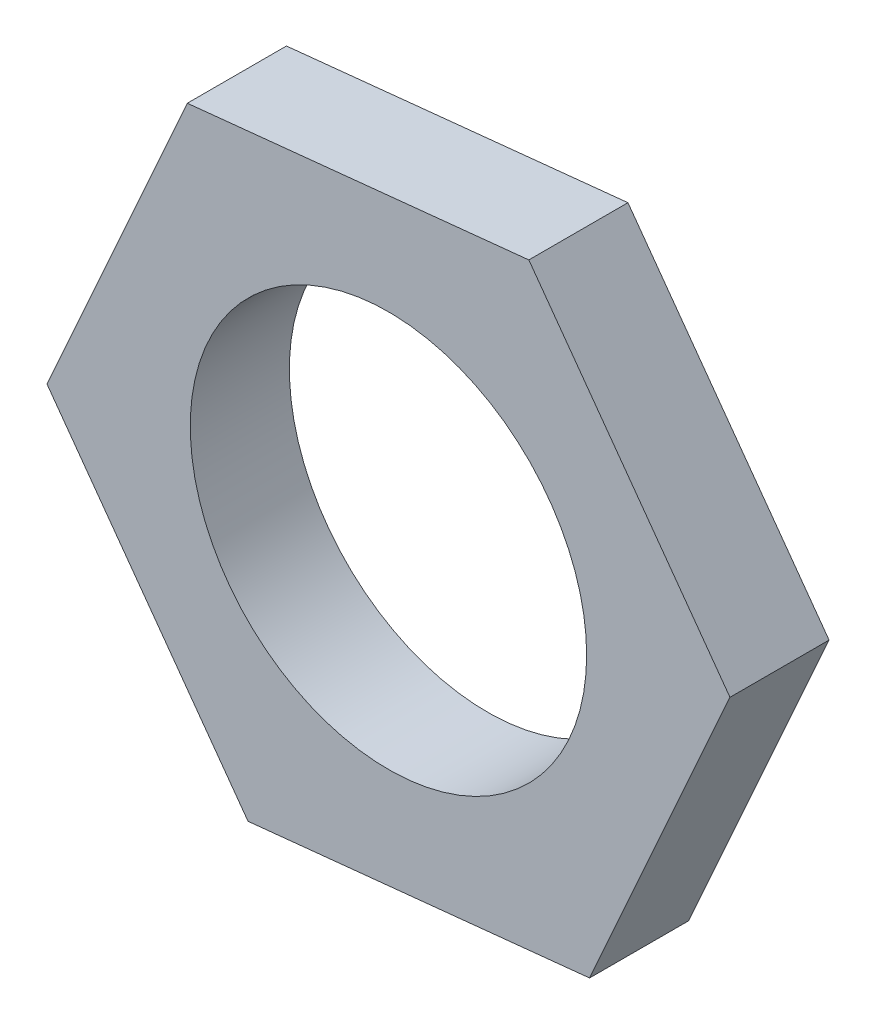
ISO-10303-21;
HEADER;
FILE_DESCRIPTION(('STEP AP214'),'2;1');
FILE_NAME('part.step','',(''),(''),'','','');
FILE_SCHEMA(('AUTOMOTIVE_DESIGN { 1 0 10303 214 1 1 1 1 }'));
ENDSEC;
DATA;
#1=APPLICATION_CONTEXT('core data for automotive mechanical design processes');
#2=APPLICATION_PROTOCOL_DEFINITION('international standard','automotive_design',2000,#1);
#3=PRODUCT_CONTEXT('',#1,'mechanical');
#4=PRODUCT('Part','Part','',(#3));
#5=PRODUCT_RELATED_PRODUCT_CATEGORY('part','',(#4));
#6=PRODUCT_DEFINITION_FORMATION('','',#4);
#7=PRODUCT_DEFINITION_CONTEXT('part definition',#1,'design');
#8=PRODUCT_DEFINITION('design','',#6,#7);
#9=PRODUCT_DEFINITION_SHAPE('','',#8);
#10=(LENGTH_UNIT() NAMED_UNIT(*) SI_UNIT(.MILLI.,.METRE.));
#11=(NAMED_UNIT(*) PLANE_ANGLE_UNIT() SI_UNIT($,.RADIAN.));
#12=(NAMED_UNIT(*) SI_UNIT($,.STERADIAN.) SOLID_ANGLE_UNIT());
#13=UNCERTAINTY_MEASURE_WITH_UNIT(LENGTH_MEASURE(1.E-05),#10,'distance_accuracy_value','');
#14=(GEOMETRIC_REPRESENTATION_CONTEXT(3) GLOBAL_UNCERTAINTY_ASSIGNED_CONTEXT((#13)) GLOBAL_UNIT_ASSIGNED_CONTEXT((#10,
#11,#12)) REPRESENTATION_CONTEXT('',''));
#15=CARTESIAN_POINT('',(0.,0.,0.));
#16=DIRECTION('',(0.,0.,1.));
#17=DIRECTION('',(1.,0.,0.));
#18=AXIS2_PLACEMENT_3D('',#15,#16,#17);
#19=CARTESIAN_POINT('',(0.,0.,0.25));
#20=DIRECTION('',(0.,0.,1.));
#21=DIRECTION('',(1.,0.,0.));
#22=AXIS2_PLACEMENT_3D('',#19,#20,#21);
#23=PLANE('',#22);
#24=DIRECTION('',(0.994770029035885,0.102140047640217,0.));
#25=VECTOR('',#24,1.);
#26=CARTESIAN_POINT('',(-0.354143022304067,-0.790305459777004,0.25));
#27=LINE('',#26,#25);
#28=CARTESIAN_POINT('',(-0.354143022304067,-0.790305459777004,0.25));
#29=VERTEX_POINT('',#28);
#30=CARTESIAN_POINT('',(0.507353093764392,-0.701849583776823,0.25));
#31=VERTEX_POINT('',#30);
#32=EDGE_CURVE('E130',#29,#31,#27,.T.);
#33=ORIENTED_EDGE('',*,*,#32,.T.);
#34=DIRECTION('',(0.408929138517761,0.912566139888568,0.));
#35=VECTOR('',#34,1.);
#36=CARTESIAN_POINT('',(0.507353093764392,-0.701849583776823,0.25));
#37=LINE('',#36,#35);
#38=CARTESIAN_POINT('',(0.861496116068459,0.0884558760001806,0.25));
#39=VERTEX_POINT('',#38);
#40=EDGE_CURVE('E88',#31,#39,#37,.T.);
#41=ORIENTED_EDGE('',*,*,#40,.T.);
#42=DIRECTION('',(-0.585840890518123,0.810426092248351,0.));
#43=VECTOR('',#42,1.);
#44=CARTESIAN_POINT('',(0.861496116068459,0.0884558760001806,0.25));
#45=LINE('',#44,#43);
#46=CARTESIAN_POINT('',(0.354143022304067,0.790305459777004,0.25));
#47=VERTEX_POINT('',#46);
#48=EDGE_CURVE('E101',#39,#47,#45,.T.);
#49=ORIENTED_EDGE('',*,*,#48,.T.);
#50=DIRECTION('',(-0.994770029035884,-0.102140047640217,0.));
#51=VECTOR('',#50,1.);
#52=CARTESIAN_POINT('',(0.354143022304067,0.790305459777004,0.25));
#53=LINE('',#52,#51);
#54=CARTESIAN_POINT('',(-0.507353093764392,0.701849583776823,0.25));
#55=VERTEX_POINT('',#54);
#56=EDGE_CURVE('E95',#47,#55,#53,.T.);
#57=ORIENTED_EDGE('',*,*,#56,.T.);
#58=DIRECTION('',(-0.408929138517761,-0.912566139888568,0.));
#59=VECTOR('',#58,1.);
#60=CARTESIAN_POINT('',(-0.507353093764392,0.701849583776823,0.25));
#61=LINE('',#60,#59);
#62=CARTESIAN_POINT('',(-0.861496116068459,-0.0884558760001806,0.25));
#63=VERTEX_POINT('',#62);
#64=EDGE_CURVE('E99',#55,#63,#61,.T.);
#65=ORIENTED_EDGE('',*,*,#64,.T.);
#66=DIRECTION('',(0.585840890518123,-0.810426092248351,0.));
#67=VECTOR('',#66,1.);
#68=CARTESIAN_POINT('',(-0.861496116068459,-0.0884558760001806,0.25));
#69=LINE('',#68,#67);
#70=EDGE_CURVE('E51',#63,#29,#69,.T.);
#71=ORIENTED_EDGE('',*,*,#70,.T.);
#72=EDGE_LOOP('',(#33,#41,#49,#57,#65,#71));
#73=FACE_BOUND('',#72,.T.);
#74=CARTESIAN_POINT('',(0.,0.,0.25));
#75=DIRECTION('',(0.,0.,1.));
#76=DIRECTION('',(1.,0.,0.));
#77=AXIS2_PLACEMENT_3D('',#74,#75,#76);
#78=CIRCLE('',#77,0.5);
#79=CARTESIAN_POINT('',(0.5,0.,0.25));
#80=VERTEX_POINT('',#79);
#81=EDGE_CURVE('E123',#80,#80,#78,.T.);
#82=ORIENTED_EDGE('',*,*,#81,.F.);
#83=EDGE_LOOP('',(#82));
#84=FACE_BOUND('',#83,.T.);
#85=ADVANCED_FACE('F34',(#73,#84),#23,.T.);
#86=CARTESIAN_POINT('',(0.,0.,0.));
#87=DIRECTION('',(0.,0.,1.));
#88=DIRECTION('',(1.,0.,0.));
#89=AXIS2_PLACEMENT_3D('',#86,#87,#88);
#90=PLANE('',#89);
#91=DIRECTION('',(0.994770029035885,0.102140047640217,0.));
#92=VECTOR('',#91,1.);
#93=CARTESIAN_POINT('',(-0.354143022304067,-0.790305459777004,0.));
#94=LINE('',#93,#92);
#95=CARTESIAN_POINT('',(-0.354143022304067,-0.790305459777004,0.));
#96=VERTEX_POINT('',#95);
#97=CARTESIAN_POINT('',(0.507353093764392,-0.701849583776823,0.));
#98=VERTEX_POINT('',#97);
#99=EDGE_CURVE('E119',#96,#98,#94,.T.);
#100=ORIENTED_EDGE('',*,*,#99,.F.);
#101=DIRECTION('',(0.585840890518123,-0.810426092248351,0.));
#102=VECTOR('',#101,1.);
#103=CARTESIAN_POINT('',(-0.861496116068459,-0.0884558760001806,0.));
#104=LINE('',#103,#102);
#105=CARTESIAN_POINT('',(-0.861496116068459,-0.0884558760001806,0.));
#106=VERTEX_POINT('',#105);
#107=EDGE_CURVE('E80',#106,#96,#104,.T.);
#108=ORIENTED_EDGE('',*,*,#107,.F.);
#109=DIRECTION('',(-0.408929138517761,-0.912566139888568,0.));
#110=VECTOR('',#109,1.);
#111=CARTESIAN_POINT('',(-0.507353093764392,0.701849583776823,0.));
#112=LINE('',#111,#110);
#113=CARTESIAN_POINT('',(-0.507353093764392,0.701849583776823,0.));
#114=VERTEX_POINT('',#113);
#115=EDGE_CURVE('E74',#114,#106,#112,.T.);
#116=ORIENTED_EDGE('',*,*,#115,.F.);
#117=DIRECTION('',(-0.994770029035884,-0.102140047640217,0.));
#118=VECTOR('',#117,1.);
#119=CARTESIAN_POINT('',(0.354143022304067,0.790305459777004,0.));
#120=LINE('',#119,#118);
#121=CARTESIAN_POINT('',(0.354143022304067,0.790305459777004,0.));
#122=VERTEX_POINT('',#121);
#123=EDGE_CURVE('E109',#122,#114,#120,.T.);
#124=ORIENTED_EDGE('',*,*,#123,.F.);
#125=DIRECTION('',(-0.585840890518123,0.810426092248351,0.));
#126=VECTOR('',#125,1.);
#127=CARTESIAN_POINT('',(0.861496116068459,0.0884558760001806,0.));
#128=LINE('',#127,#126);
#129=CARTESIAN_POINT('',(0.861496116068459,0.0884558760001806,0.));
#130=VERTEX_POINT('',#129);
#131=EDGE_CURVE('E125',#130,#122,#128,.T.);
#132=ORIENTED_EDGE('',*,*,#131,.F.);
#133=DIRECTION('',(0.408929138517761,0.912566139888568,0.));
#134=VECTOR('',#133,1.);
#135=CARTESIAN_POINT('',(0.507353093764392,-0.701849583776823,0.));
#136=LINE('',#135,#134);
#137=EDGE_CURVE('E122',#98,#130,#136,.T.);
#138=ORIENTED_EDGE('',*,*,#137,.F.);
#139=EDGE_LOOP('',(#100,#108,#116,#124,#132,#138));
#140=FACE_BOUND('',#139,.T.);
#141=CARTESIAN_POINT('',(0.,0.,0.));
#142=DIRECTION('',(0.,0.,1.));
#143=DIRECTION('',(1.,0.,0.));
#144=AXIS2_PLACEMENT_3D('',#141,#142,#143);
#145=CIRCLE('',#144,0.5);
#146=CARTESIAN_POINT('',(0.5,0.,0.));
#147=VERTEX_POINT('',#146);
#148=EDGE_CURVE('E223',#147,#147,#145,.T.);
#149=ORIENTED_EDGE('',*,*,#148,.T.);
#150=EDGE_LOOP('',(#149));
#151=FACE_BOUND('',#150,.T.);
#152=ADVANCED_FACE('F139',(#140,#151),#90,.F.);
#153=CARTESIAN_POINT('',(-0.354143022304067,-0.790305459777004,0.25));
#154=DIRECTION('',(-0.102140047640217,0.994770029035884,0.));
#155=DIRECTION('',(-0.994770029035884,-0.102140047640217,0.));
#156=AXIS2_PLACEMENT_3D('',#153,#154,#155);
#157=PLANE('',#156);
#158=ORIENTED_EDGE('',*,*,#99,.T.);
#159=DIRECTION('',(0.,0.,-1.));
#160=VECTOR('',#159,1.);
#161=CARTESIAN_POINT('',(0.507353093764392,-0.701849583776823,0.25));
#162=LINE('',#161,#160);
#163=EDGE_CURVE('E11',#31,#98,#162,.T.);
#164=ORIENTED_EDGE('',*,*,#163,.F.);
#165=ORIENTED_EDGE('',*,*,#32,.F.);
#166=DIRECTION('',(0.,0.,-1.));
#167=VECTOR('',#166,1.);
#168=CARTESIAN_POINT('',(-0.354143022304067,-0.790305459777004,0.25));
#169=LINE('',#168,#167);
#170=EDGE_CURVE('E115',#29,#96,#169,.T.);
#171=ORIENTED_EDGE('',*,*,#170,.T.);
#172=EDGE_LOOP('',(#158,#164,#165,#171));
#173=FACE_BOUND('',#172,.T.);
#174=ADVANCED_FACE('F36',(#173),#157,.F.);
#175=CARTESIAN_POINT('',(0.507353093764392,-0.701849583776823,0.25));
#176=DIRECTION('',(-0.912566139888568,0.408929138517761,0.));
#177=DIRECTION('',(-0.408929138517761,-0.912566139888568,0.));
#178=AXIS2_PLACEMENT_3D('',#175,#176,#177);
#179=PLANE('',#178);
#180=ORIENTED_EDGE('',*,*,#137,.T.);
#181=DIRECTION('',(0.,0.,-1.));
#182=VECTOR('',#181,1.);
#183=CARTESIAN_POINT('',(0.861496116068459,0.0884558760001806,0.25));
#184=LINE('',#183,#182);
#185=EDGE_CURVE('E43',#39,#130,#184,.T.);
#186=ORIENTED_EDGE('',*,*,#185,.F.);
#187=ORIENTED_EDGE('',*,*,#40,.F.);
#188=ORIENTED_EDGE('',*,*,#163,.T.);
#189=EDGE_LOOP('',(#180,#186,#187,#188));
#190=FACE_BOUND('',#189,.T.);
#191=ADVANCED_FACE('F164',(#190),#179,.F.);
#192=CARTESIAN_POINT('',(0.861496116068459,0.0884558760001806,0.25));
#193=DIRECTION('',(-0.810426092248351,-0.585840890518123,0.));
#194=DIRECTION('',(0.585840890518123,-0.810426092248351,0.));
#195=AXIS2_PLACEMENT_3D('',#192,#193,#194);
#196=PLANE('',#195);
#197=ORIENTED_EDGE('',*,*,#131,.T.);
#198=DIRECTION('',(0.,0.,-1.));
#199=VECTOR('',#198,1.);
#200=CARTESIAN_POINT('',(0.354143022304067,0.790305459777004,0.25));
#201=LINE('',#200,#199);
#202=EDGE_CURVE('E110',#47,#122,#201,.T.);
#203=ORIENTED_EDGE('',*,*,#202,.F.);
#204=ORIENTED_EDGE('',*,*,#48,.F.);
#205=ORIENTED_EDGE('',*,*,#185,.T.);
#206=EDGE_LOOP('',(#197,#203,#204,#205));
#207=FACE_BOUND('',#206,.T.);
#208=ADVANCED_FACE('F136',(#207),#196,.F.);
#209=CARTESIAN_POINT('',(0.354143022304067,0.790305459777004,0.25));
#210=DIRECTION('',(0.102140047640217,-0.994770029035884,0.));
#211=DIRECTION('',(0.994770029035884,0.102140047640217,0.));
#212=AXIS2_PLACEMENT_3D('',#209,#210,#211);
#213=PLANE('',#212);
#214=ORIENTED_EDGE('',*,*,#123,.T.);
#215=DIRECTION('',(0.,0.,-1.));
#216=VECTOR('',#215,1.);
#217=CARTESIAN_POINT('',(-0.507353093764392,0.701849583776823,0.25));
#218=LINE('',#217,#216);
#219=EDGE_CURVE('E106',#55,#114,#218,.T.);
#220=ORIENTED_EDGE('',*,*,#219,.F.);
#221=ORIENTED_EDGE('',*,*,#56,.F.);
#222=ORIENTED_EDGE('',*,*,#202,.T.);
#223=EDGE_LOOP('',(#214,#220,#221,#222));
#224=FACE_BOUND('',#223,.T.);
#225=ADVANCED_FACE('F107',(#224),#213,.F.);
#226=CARTESIAN_POINT('',(-0.507353093764392,0.701849583776823,0.25));
#227=DIRECTION('',(0.912566139888568,-0.408929138517761,0.));
#228=DIRECTION('',(0.408929138517762,0.912566139888568,0.));
#229=AXIS2_PLACEMENT_3D('',#226,#227,#228);
#230=PLANE('',#229);
#231=ORIENTED_EDGE('',*,*,#115,.T.);
#232=DIRECTION('',(0.,0.,-1.));
#233=VECTOR('',#232,1.);
#234=CARTESIAN_POINT('',(-0.861496116068459,-0.0884558760001806,0.25));
#235=LINE('',#234,#233);
#236=EDGE_CURVE('E111',#63,#106,#235,.T.);
#237=ORIENTED_EDGE('',*,*,#236,.F.);
#238=ORIENTED_EDGE('',*,*,#64,.F.);
#239=ORIENTED_EDGE('',*,*,#219,.T.);
#240=EDGE_LOOP('',(#231,#237,#238,#239));
#241=FACE_BOUND('',#240,.T.);
#242=ADVANCED_FACE('F113',(#241),#230,.F.);
#243=CARTESIAN_POINT('',(-0.861496116068459,-0.0884558760001806,0.25));
#244=DIRECTION('',(0.810426092248351,0.585840890518123,0.));
#245=DIRECTION('',(-0.585840890518123,0.810426092248351,0.));
#246=AXIS2_PLACEMENT_3D('',#243,#244,#245);
#247=PLANE('',#246);
#248=ORIENTED_EDGE('',*,*,#107,.T.);
#249=ORIENTED_EDGE('',*,*,#170,.F.);
#250=ORIENTED_EDGE('',*,*,#70,.F.);
#251=ORIENTED_EDGE('',*,*,#236,.T.);
#252=EDGE_LOOP('',(#248,#249,#250,#251));
#253=FACE_BOUND('',#252,.T.);
#254=ADVANCED_FACE('F144',(#253),#247,.F.);
#255=CARTESIAN_POINT('',(0.,0.,0.25));
#256=DIRECTION('',(0.,0.,-1.));
#257=DIRECTION('',(-1.,0.,0.));
#258=AXIS2_PLACEMENT_3D('',#255,#256,#257);
#259=CYLINDRICAL_SURFACE('',#258,0.5);
#260=ORIENTED_EDGE('',*,*,#81,.T.);
#261=EDGE_LOOP('',(#260));
#262=FACE_BOUND('',#261,.T.);
#263=ORIENTED_EDGE('',*,*,#148,.F.);
#264=EDGE_LOOP('',(#263));
#265=FACE_BOUND('',#264,.T.);
#266=ADVANCED_FACE('F146',(#262,#265),#259,.F.);
#267=CLOSED_SHELL('',(#85,#152,#174,#191,#208,#225,#242,#254,#266));
#268=MANIFOLD_SOLID_BREP('B2',#267);
#269=ADVANCED_BREP_SHAPE_REPRESENTATION('',(#18,#268),#14);
#270=SHAPE_DEFINITION_REPRESENTATION(#9,#269);
ENDSEC;
END-ISO-10303-21;
